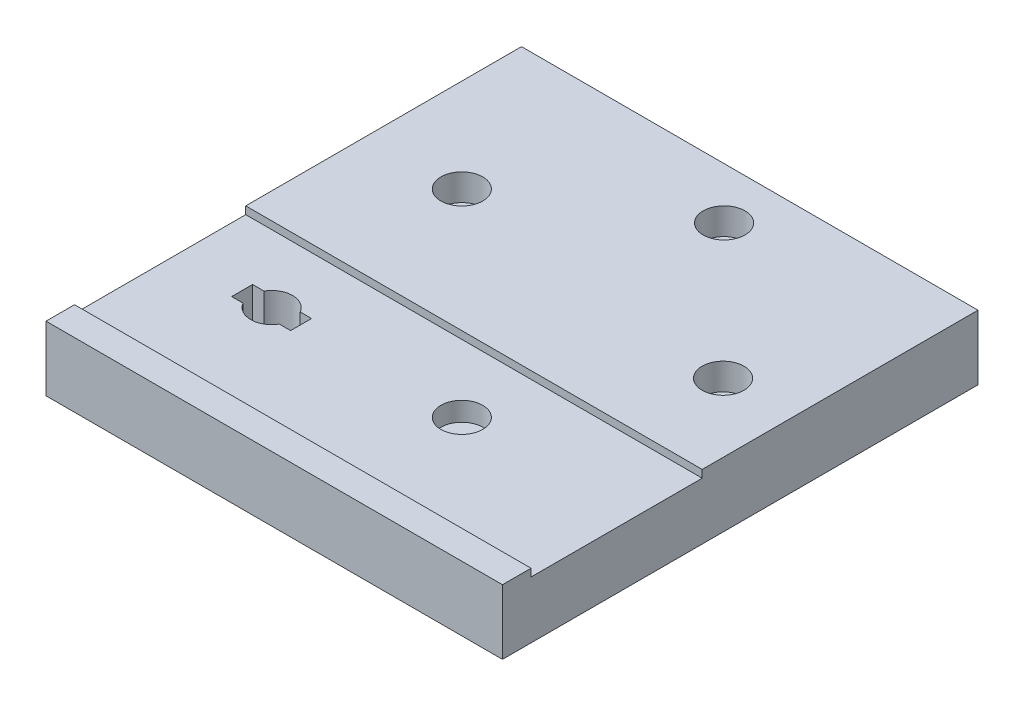
ISO-10303-21;
HEADER;
FILE_DESCRIPTION(('STEP AP214'),'2;1');
FILE_NAME('part.step','',(''),(''),'','','');
FILE_SCHEMA(('AUTOMOTIVE_DESIGN { 1 0 10303 214 1 1 1 1 }'));
ENDSEC;
DATA;
#1=APPLICATION_CONTEXT('core data for automotive mechanical design processes');
#2=APPLICATION_PROTOCOL_DEFINITION('international standard','automotive_design',2000,#1);
#3=PRODUCT_CONTEXT('',#1,'mechanical');
#4=PRODUCT('Part','Part','',(#3));
#5=PRODUCT_RELATED_PRODUCT_CATEGORY('part','',(#4));
#6=PRODUCT_DEFINITION_FORMATION('','',#4);
#7=PRODUCT_DEFINITION_CONTEXT('part definition',#1,'design');
#8=PRODUCT_DEFINITION('design','',#6,#7);
#9=PRODUCT_DEFINITION_SHAPE('','',#8);
#10=(LENGTH_UNIT() NAMED_UNIT(*) SI_UNIT(.MILLI.,.METRE.));
#11=(NAMED_UNIT(*) PLANE_ANGLE_UNIT() SI_UNIT($,.RADIAN.));
#12=(NAMED_UNIT(*) SI_UNIT($,.STERADIAN.) SOLID_ANGLE_UNIT());
#13=UNCERTAINTY_MEASURE_WITH_UNIT(LENGTH_MEASURE(1.E-05),#10,'distance_accuracy_value','');
#14=(GEOMETRIC_REPRESENTATION_CONTEXT(3) GLOBAL_UNCERTAINTY_ASSIGNED_CONTEXT((#13)) GLOBAL_UNIT_ASSIGNED_CONTEXT((#10,
#11,#12)) REPRESENTATION_CONTEXT('',''));
#15=CARTESIAN_POINT('',(0.,0.,0.));
#16=DIRECTION('',(0.,0.,1.));
#17=DIRECTION('',(1.,0.,0.));
#18=AXIS2_PLACEMENT_3D('',#15,#16,#17);
#19=CARTESIAN_POINT('',(-225.445279058098,153.,-7.25516146171794));
#20=DIRECTION('',(0.,-1.,0.));
#21=DIRECTION('',(0.,0.,-1.));
#22=AXIS2_PLACEMENT_3D('',#19,#20,#21);
#23=CYLINDRICAL_SURFACE('',#22,5.50000000000002);
#24=CARTESIAN_POINT('',(-225.445279058098,-9.99999999999999,-7.25516146171794));
#25=DIRECTION('',(0.,1.,0.));
#26=DIRECTION('',(0.,0.,1.));
#27=AXIS2_PLACEMENT_3D('',#24,#25,#26);
#28=CIRCLE('',#27,5.50000000000002);
#29=CARTESIAN_POINT('',(-230.208418778913,-9.99999999999999,-4.50516146171794));
#30=VERTEX_POINT('',#29);
#31=CARTESIAN_POINT('',(-220.682139337284,-9.99999999999999,-4.50516146171794));
#32=VERTEX_POINT('',#31);
#33=EDGE_CURVE('E212',#30,#32,#28,.T.);
#34=ORIENTED_EDGE('',*,*,#33,.F.);
#35=DIRECTION('',(0.,-1.,0.));
#36=VECTOR('',#35,1.);
#37=CARTESIAN_POINT('',(-230.208418778913,153.,-4.50516146171794));
#38=LINE('',#37,#36);
#39=CARTESIAN_POINT('',(-230.208418778913,5.,-4.50516146171794));
#40=VERTEX_POINT('',#39);
#41=EDGE_CURVE('E208',#30,#40,#38,.F.);
#42=ORIENTED_EDGE('',*,*,#41,.T.);
#43=CARTESIAN_POINT('',(-225.445279058098,5.,-7.25516146171794));
#44=DIRECTION('',(0.,-1.,0.));
#45=DIRECTION('',(0.,0.,-1.));
#46=AXIS2_PLACEMENT_3D('',#43,#44,#45);
#47=CIRCLE('',#46,5.50000000000002);
#48=CARTESIAN_POINT('',(-220.682139337284,5.,-4.50516146171794));
#49=VERTEX_POINT('',#48);
#50=EDGE_CURVE('E295',#49,#40,#47,.T.);
#51=ORIENTED_EDGE('',*,*,#50,.F.);
#52=DIRECTION('',(0.,-1.,0.));
#53=VECTOR('',#52,1.);
#54=CARTESIAN_POINT('',(-220.682139337284,153.,-4.50516146171794));
#55=LINE('',#54,#53);
#56=EDGE_CURVE('E204',#49,#32,#55,.T.);
#57=ORIENTED_EDGE('',*,*,#56,.T.);
#58=EDGE_LOOP('',(#34,#42,#51,#57));
#59=FACE_BOUND('',#58,.T.);
#60=ADVANCED_FACE('F38',(#59),#23,.F.);
#61=CARTESIAN_POINT('',(-60.,5.,27.5));
#62=DIRECTION('',(0.,0.,-1.));
#63=DIRECTION('',(-1.,0.,0.));
#64=AXIS2_PLACEMENT_3D('',#61,#62,#63);
#65=PLANE('',#64);
#66=DIRECTION('',(1.,0.,0.));
#67=VECTOR('',#66,1.);
#68=CARTESIAN_POINT('',(-250.,7.00000000000002,27.5));
#69=LINE('',#68,#67);
#70=CARTESIAN_POINT('',(-250.,7.00000000000002,27.5));
#71=VERTEX_POINT('',#70);
#72=CARTESIAN_POINT('',(-130.,7.00000000000002,27.5));
#73=VERTEX_POINT('',#72);
#74=EDGE_CURVE('E216',#71,#73,#69,.T.);
#75=ORIENTED_EDGE('',*,*,#74,.F.);
#76=DIRECTION('',(0.,1.,0.));
#77=VECTOR('',#76,1.);
#78=CARTESIAN_POINT('',(-250.,25.,27.5));
#79=LINE('',#78,#77);
#80=CARTESIAN_POINT('',(-250.,-9.99999999999999,27.5));
#81=VERTEX_POINT('',#80);
#82=EDGE_CURVE('E304',#81,#71,#79,.T.);
#83=ORIENTED_EDGE('',*,*,#82,.F.);
#84=DIRECTION('',(-1.,0.,0.));
#85=VECTOR('',#84,1.);
#86=CARTESIAN_POINT('',(-130.,-9.99999999999999,27.5));
#87=LINE('',#86,#85);
#88=CARTESIAN_POINT('',(-130.,-9.99999999999999,27.5));
#89=VERTEX_POINT('',#88);
#90=EDGE_CURVE('E248',#89,#81,#87,.T.);
#91=ORIENTED_EDGE('',*,*,#90,.F.);
#92=DIRECTION('',(0.,-1.,0.));
#93=VECTOR('',#92,1.);
#94=CARTESIAN_POINT('',(-130.,25.,27.5));
#95=LINE('',#94,#93);
#96=EDGE_CURVE('E261',#73,#89,#95,.T.);
#97=ORIENTED_EDGE('',*,*,#96,.F.);
#98=EDGE_LOOP('',(#75,#83,#91,#97));
#99=FACE_BOUND('',#98,.T.);
#100=ADVANCED_FACE('F40',(#99),#65,.F.);
#101=CARTESIAN_POINT('',(-60.,25.,20.));
#102=DIRECTION('',(0.,0.,1.));
#103=DIRECTION('',(1.,0.,0.));
#104=AXIS2_PLACEMENT_3D('',#101,#102,#103);
#105=PLANE('',#104);
#106=DIRECTION('',(-1.,0.,0.));
#107=VECTOR('',#106,1.);
#108=CARTESIAN_POINT('',(-60.,7.00000000000002,20.));
#109=LINE('',#108,#107);
#110=CARTESIAN_POINT('',(-130.,7.00000000000002,20.));
#111=VERTEX_POINT('',#110);
#112=CARTESIAN_POINT('',(-250.,7.00000000000002,20.));
#113=VERTEX_POINT('',#112);
#114=EDGE_CURVE('E241',#111,#113,#109,.T.);
#115=ORIENTED_EDGE('',*,*,#114,.F.);
#116=DIRECTION('',(0.,1.,0.));
#117=VECTOR('',#116,1.);
#118=CARTESIAN_POINT('',(-130.,25.,20.));
#119=LINE('',#118,#117);
#120=CARTESIAN_POINT('',(-130.,5.,20.));
#121=VERTEX_POINT('',#120);
#122=EDGE_CURVE('E275',#121,#111,#119,.T.);
#123=ORIENTED_EDGE('',*,*,#122,.F.);
#124=DIRECTION('',(-1.,0.,0.));
#125=VECTOR('',#124,1.);
#126=CARTESIAN_POINT('',(-60.,5.,20.));
#127=LINE('',#126,#125);
#128=CARTESIAN_POINT('',(-250.,5.,20.));
#129=VERTEX_POINT('',#128);
#130=EDGE_CURVE('E323',#121,#129,#127,.T.);
#131=ORIENTED_EDGE('',*,*,#130,.T.);
#132=DIRECTION('',(0.,-1.,0.));
#133=VECTOR('',#132,1.);
#134=CARTESIAN_POINT('',(-250.,5.,20.));
#135=LINE('',#134,#133);
#136=EDGE_CURVE('E308',#113,#129,#135,.T.);
#137=ORIENTED_EDGE('',*,*,#136,.F.);
#138=EDGE_LOOP('',(#115,#123,#131,#137));
#139=FACE_BOUND('',#138,.T.);
#140=ADVANCED_FACE('F389',(#139),#105,.F.);
#141=CARTESIAN_POINT('',(60.,25.,-25.));
#142=DIRECTION('',(0.,0.,-1.));
#143=DIRECTION('',(-1.,0.,0.));
#144=AXIS2_PLACEMENT_3D('',#141,#142,#143);
#145=PLANE('',#144);
#146=DIRECTION('',(1.,0.,0.));
#147=VECTOR('',#146,1.);
#148=CARTESIAN_POINT('',(60.,7.00000000000002,-25.));
#149=LINE('',#148,#147);
#150=CARTESIAN_POINT('',(-250.,7.00000000000002,-25.));
#151=VERTEX_POINT('',#150);
#152=CARTESIAN_POINT('',(-130.,7.00000000000002,-25.));
#153=VERTEX_POINT('',#152);
#154=EDGE_CURVE('E238',#151,#153,#149,.T.);
#155=ORIENTED_EDGE('',*,*,#154,.F.);
#156=DIRECTION('',(0.,1.,0.));
#157=VECTOR('',#156,1.);
#158=CARTESIAN_POINT('',(-250.,25.,-25.));
#159=LINE('',#158,#157);
#160=CARTESIAN_POINT('',(-250.,5.,-25.));
#161=VERTEX_POINT('',#160);
#162=EDGE_CURVE('E315',#161,#151,#159,.T.);
#163=ORIENTED_EDGE('',*,*,#162,.F.);
#164=DIRECTION('',(1.,0.,0.));
#165=VECTOR('',#164,1.);
#166=CARTESIAN_POINT('',(60.,5.,-25.));
#167=LINE('',#166,#165);
#168=CARTESIAN_POINT('',(-130.,5.,-25.));
#169=VERTEX_POINT('',#168);
#170=EDGE_CURVE('E319',#161,#169,#167,.T.);
#171=ORIENTED_EDGE('',*,*,#170,.T.);
#172=DIRECTION('',(0.,-1.,0.));
#173=VECTOR('',#172,1.);
#174=CARTESIAN_POINT('',(-130.,25.,-25.));
#175=LINE('',#174,#173);
#176=EDGE_CURVE('E269',#153,#169,#175,.T.);
#177=ORIENTED_EDGE('',*,*,#176,.F.);
#178=EDGE_LOOP('',(#155,#163,#171,#177));
#179=FACE_BOUND('',#178,.T.);
#180=ADVANCED_FACE('F410',(#179),#145,.F.);
#181=CARTESIAN_POINT('',(0.,0.,-97.5));
#182=DIRECTION('',(0.,0.,1.));
#183=DIRECTION('',(1.,0.,0.));
#184=AXIS2_PLACEMENT_3D('',#181,#182,#183);
#185=PLANE('',#184);
#186=DIRECTION('',(-1.,0.,0.));
#187=VECTOR('',#186,1.);
#188=CARTESIAN_POINT('',(-250.,7.00000000000002,-97.5));
#189=LINE('',#188,#187);
#190=CARTESIAN_POINT('',(-130.,7.00000000000002,-97.5));
#191=VERTEX_POINT('',#190);
#192=CARTESIAN_POINT('',(-250.,7.00000000000002,-97.5));
#193=VERTEX_POINT('',#192);
#194=EDGE_CURVE('E223',#191,#193,#189,.T.);
#195=ORIENTED_EDGE('',*,*,#194,.F.);
#196=DIRECTION('',(0.,1.,0.));
#197=VECTOR('',#196,1.);
#198=CARTESIAN_POINT('',(-130.,25.,-97.5));
#199=LINE('',#198,#197);
#200=CARTESIAN_POINT('',(-130.,-9.99999999999999,-97.5));
#201=VERTEX_POINT('',#200);
#202=EDGE_CURVE('E264',#201,#191,#199,.T.);
#203=ORIENTED_EDGE('',*,*,#202,.F.);
#204=DIRECTION('',(1.,0.,0.));
#205=VECTOR('',#204,1.);
#206=CARTESIAN_POINT('',(-130.,-9.99999999999999,-97.5));
#207=LINE('',#206,#205);
#208=CARTESIAN_POINT('',(-250.,-9.99999999999999,-97.5));
#209=VERTEX_POINT('',#208);
#210=EDGE_CURVE('E256',#209,#201,#207,.T.);
#211=ORIENTED_EDGE('',*,*,#210,.F.);
#212=DIRECTION('',(0.,1.,0.));
#213=VECTOR('',#212,1.);
#214=CARTESIAN_POINT('',(-250.,25.,-97.5));
#215=LINE('',#214,#213);
#216=EDGE_CURVE('E300',#209,#193,#215,.T.);
#217=ORIENTED_EDGE('',*,*,#216,.T.);
#218=EDGE_LOOP('',(#195,#203,#211,#217));
#219=FACE_BOUND('',#218,.T.);
#220=ADVANCED_FACE('F414',(#219),#185,.F.);
#221=CARTESIAN_POINT('',(-250.,0.,0.));
#222=DIRECTION('',(1.,0.,0.));
#223=DIRECTION('',(0.,0.,-1.));
#224=AXIS2_PLACEMENT_3D('',#221,#222,#223);
#225=PLANE('',#224);
#226=DIRECTION('',(0.,0.,1.));
#227=VECTOR('',#226,1.);
#228=CARTESIAN_POINT('',(-250.,7.00000000000002,-97.5));
#229=LINE('',#228,#227);
#230=EDGE_CURVE('E213',#193,#151,#229,.T.);
#231=ORIENTED_EDGE('',*,*,#230,.F.);
#232=ORIENTED_EDGE('',*,*,#216,.F.);
#233=DIRECTION('',(0.,0.,-1.));
#234=VECTOR('',#233,1.);
#235=CARTESIAN_POINT('',(-250.,-9.99999999999999,27.5));
#236=LINE('',#235,#234);
#237=EDGE_CURVE('E252',#81,#209,#236,.T.);
#238=ORIENTED_EDGE('',*,*,#237,.F.);
#239=ORIENTED_EDGE('',*,*,#82,.T.);
#240=EDGE_CURVE('E217',#113,#71,#229,.T.);
#241=ORIENTED_EDGE('',*,*,#240,.F.);
#242=ORIENTED_EDGE('',*,*,#136,.T.);
#243=DIRECTION('',(0.,0.,-1.));
#244=VECTOR('',#243,1.);
#245=CARTESIAN_POINT('',(-250.,5.,-25.));
#246=LINE('',#245,#244);
#247=EDGE_CURVE('E311',#129,#161,#246,.T.);
#248=ORIENTED_EDGE('',*,*,#247,.T.);
#249=ORIENTED_EDGE('',*,*,#162,.T.);
#250=EDGE_LOOP('',(#231,#232,#238,#239,#241,#242,#248,#249));
#251=FACE_BOUND('',#250,.T.);
#252=ADVANCED_FACE('F404',(#251),#225,.F.);
#253=CARTESIAN_POINT('',(-130.,0.,0.));
#254=DIRECTION('',(1.,0.,0.));
#255=DIRECTION('',(0.,0.,-1.));
#256=AXIS2_PLACEMENT_3D('',#253,#254,#255);
#257=PLANE('',#256);
#258=ORIENTED_EDGE('',*,*,#202,.T.);
#259=DIRECTION('',(0.,0.,1.));
#260=VECTOR('',#259,1.);
#261=CARTESIAN_POINT('',(-130.,7.00000000000002,0.));
#262=LINE('',#261,#260);
#263=EDGE_CURVE('E327',#191,#153,#262,.T.);
#264=ORIENTED_EDGE('',*,*,#263,.T.);
#265=ORIENTED_EDGE('',*,*,#176,.T.);
#266=DIRECTION('',(0.,0.,1.));
#267=VECTOR('',#266,1.);
#268=CARTESIAN_POINT('',(-130.,5.,0.));
#269=LINE('',#268,#267);
#270=EDGE_CURVE('E272',#169,#121,#269,.T.);
#271=ORIENTED_EDGE('',*,*,#270,.T.);
#272=ORIENTED_EDGE('',*,*,#122,.T.);
#273=DIRECTION('',(0.,0.,-1.));
#274=VECTOR('',#273,1.);
#275=CARTESIAN_POINT('',(-130.,7.00000000000002,-97.5));
#276=LINE('',#275,#274);
#277=EDGE_CURVE('E220',#73,#111,#276,.T.);
#278=ORIENTED_EDGE('',*,*,#277,.F.);
#279=ORIENTED_EDGE('',*,*,#96,.T.);
#280=DIRECTION('',(0.,0.,1.));
#281=VECTOR('',#280,1.);
#282=CARTESIAN_POINT('',(-130.,-9.99999999999999,27.5));
#283=LINE('',#282,#281);
#284=EDGE_CURVE('E244',#201,#89,#283,.T.);
#285=ORIENTED_EDGE('',*,*,#284,.F.);
#286=EDGE_LOOP('',(#258,#264,#265,#271,#272,#278,#279,#285));
#287=FACE_BOUND('',#286,.T.);
#288=ADVANCED_FACE('F400',(#287),#257,.T.);
#289=CARTESIAN_POINT('',(0.,5.,0.));
#290=DIRECTION('',(0.,-1.,0.));
#291=DIRECTION('',(0.,0.,-1.));
#292=AXIS2_PLACEMENT_3D('',#289,#290,#291);
#293=PLANE('',#292);
#294=ORIENTED_EDGE('',*,*,#50,.T.);
#295=DIRECTION('',(1.,0.,0.));
#296=VECTOR('',#295,1.);
#297=CARTESIAN_POINT('',(-233.195279058098,5.,-4.50516146171794));
#298=LINE('',#297,#296);
#299=CARTESIAN_POINT('',(-233.195279058098,5.,-4.50516146171794));
#300=VERTEX_POINT('',#299);
#301=EDGE_CURVE('E160',#300,#40,#298,.T.);
#302=ORIENTED_EDGE('',*,*,#301,.F.);
#303=DIRECTION('',(0.,0.,1.));
#304=VECTOR('',#303,1.);
#305=CARTESIAN_POINT('',(-233.195279058098,5.,-10.0051614617179));
#306=LINE('',#305,#304);
#307=CARTESIAN_POINT('',(-233.195279058098,5.,-10.0051614617179));
#308=VERTEX_POINT('',#307);
#309=EDGE_CURVE('E181',#308,#300,#306,.T.);
#310=ORIENTED_EDGE('',*,*,#309,.F.);
#311=DIRECTION('',(-1.,0.,0.));
#312=VECTOR('',#311,1.);
#313=CARTESIAN_POINT('',(-233.195279058098,5.,-10.0051614617179));
#314=LINE('',#313,#312);
#315=CARTESIAN_POINT('',(-230.208418778913,5.,-10.0051614617179));
#316=VERTEX_POINT('',#315);
#317=EDGE_CURVE('E171',#316,#308,#314,.T.);
#318=ORIENTED_EDGE('',*,*,#317,.F.);
#319=CARTESIAN_POINT('',(-220.682139337284,5.,-10.0051614617179));
#320=VERTEX_POINT('',#319);
#321=EDGE_CURVE('E179',#316,#320,#47,.T.);
#322=ORIENTED_EDGE('',*,*,#321,.T.);
#323=CARTESIAN_POINT('',(-217.695279058098,5.,-10.0051614617179));
#324=VERTEX_POINT('',#323);
#325=EDGE_CURVE('E155',#324,#320,#314,.T.);
#326=ORIENTED_EDGE('',*,*,#325,.F.);
#327=DIRECTION('',(0.,0.,-1.));
#328=VECTOR('',#327,1.);
#329=CARTESIAN_POINT('',(-217.695279058098,5.,-10.0051614617179));
#330=LINE('',#329,#328);
#331=CARTESIAN_POINT('',(-217.695279058098,5.,-4.50516146171794));
#332=VERTEX_POINT('',#331);
#333=EDGE_CURVE('E163',#332,#324,#330,.T.);
#334=ORIENTED_EDGE('',*,*,#333,.F.);
#335=EDGE_CURVE('E186',#49,#332,#298,.T.);
#336=ORIENTED_EDGE('',*,*,#335,.F.);
#337=EDGE_LOOP('',(#294,#302,#310,#318,#322,#326,#334,#336));
#338=FACE_BOUND('',#337,.T.);
#339=CARTESIAN_POINT('',(-175.445279058098,5.,-7.25516146171793));
#340=DIRECTION('',(0.,-1.,0.));
#341=DIRECTION('',(0.,0.,-1.));
#342=AXIS2_PLACEMENT_3D('',#339,#340,#341);
#343=CIRCLE('',#342,5.50000000000002);
#344=CARTESIAN_POINT('',(-175.445279058098,5.,-12.755161461718));
#345=VERTEX_POINT('',#344);
#346=EDGE_CURVE('E296',#345,#345,#343,.T.);
#347=ORIENTED_EDGE('',*,*,#346,.T.);
#348=EDGE_LOOP('',(#347));
#349=FACE_BOUND('',#348,.T.);
#350=ORIENTED_EDGE('',*,*,#270,.F.);
#351=ORIENTED_EDGE('',*,*,#170,.F.);
#352=ORIENTED_EDGE('',*,*,#247,.F.);
#353=ORIENTED_EDGE('',*,*,#130,.F.);
#354=EDGE_LOOP('',(#350,#351,#352,#353));
#355=FACE_BOUND('',#354,.T.);
#356=ADVANCED_FACE('F175',(#338,#349,#355),#293,.F.);
#357=CARTESIAN_POINT('',(-220.682139337284,-9.99999999999999,-10.0051614617179));
#358=VERTEX_POINT('',#357);
#359=CARTESIAN_POINT('',(-230.208418778913,-9.99999999999999,-10.0051614617179));
#360=VERTEX_POINT('',#359);
#361=EDGE_CURVE('E335',#358,#360,#28,.T.);
#362=ORIENTED_EDGE('',*,*,#361,.F.);
#363=DIRECTION('',(0.,-1.,0.));
#364=VECTOR('',#363,1.);
#365=CARTESIAN_POINT('',(-220.682139337284,153.,-10.0051614617179));
#366=LINE('',#365,#364);
#367=EDGE_CURVE('E63',#358,#320,#366,.F.);
#368=ORIENTED_EDGE('',*,*,#367,.T.);
#369=ORIENTED_EDGE('',*,*,#321,.F.);
#370=DIRECTION('',(0.,-1.,0.));
#371=VECTOR('',#370,1.);
#372=CARTESIAN_POINT('',(-230.208418778913,153.,-10.0051614617179));
#373=LINE('',#372,#371);
#374=EDGE_CURVE('E193',#316,#360,#373,.T.);
#375=ORIENTED_EDGE('',*,*,#374,.T.);
#376=EDGE_LOOP('',(#362,#368,#369,#375));
#377=FACE_BOUND('',#376,.T.);
#378=ADVANCED_FACE('F368',(#377),#23,.F.);
#379=CARTESIAN_POINT('',(-175.445279058098,153.,-7.25516146171793));
#380=DIRECTION('',(0.,-1.,0.));
#381=DIRECTION('',(0.,0.,-1.));
#382=AXIS2_PLACEMENT_3D('',#379,#380,#381);
#383=CYLINDRICAL_SURFACE('',#382,5.50000000000002);
#384=CARTESIAN_POINT('',(-175.445279058098,0.,-7.25516146171793));
#385=DIRECTION('',(0.,-1.,0.));
#386=DIRECTION('',(0.,0.,-1.));
#387=AXIS2_PLACEMENT_3D('',#384,#385,#386);
#388=CIRCLE('',#387,5.50000000000002);
#389=CARTESIAN_POINT('',(-175.445279058098,0.,-12.755161461718));
#390=VERTEX_POINT('',#389);
#391=EDGE_CURVE('E283',#390,#390,#388,.T.);
#392=ORIENTED_EDGE('',*,*,#391,.T.);
#393=EDGE_LOOP('',(#392));
#394=FACE_BOUND('',#393,.T.);
#395=ORIENTED_EDGE('',*,*,#346,.F.);
#396=EDGE_LOOP('',(#395));
#397=FACE_BOUND('',#396,.T.);
#398=ADVANCED_FACE('F393',(#394,#397),#383,.F.);
#399=CARTESIAN_POINT('',(0.,0.,0.));
#400=DIRECTION('',(0.,1.,0.));
#401=DIRECTION('',(0.,0.,1.));
#402=AXIS2_PLACEMENT_3D('',#399,#400,#401);
#403=PLANE('',#402);
#404=ORIENTED_EDGE('',*,*,#391,.F.);
#405=EDGE_LOOP('',(#404));
#406=FACE_BOUND('',#405,.T.);
#407=ADVANCED_FACE('F397',(#406),#403,.T.);
#408=CARTESIAN_POINT('',(0.,-9.99999999999999,0.));
#409=DIRECTION('',(0.,1.,0.));
#410=DIRECTION('',(0.,0.,1.));
#411=AXIS2_PLACEMENT_3D('',#408,#409,#410);
#412=PLANE('',#411);
#413=ORIENTED_EDGE('',*,*,#33,.T.);
#414=DIRECTION('',(1.,0.,0.));
#415=VECTOR('',#414,1.);
#416=CARTESIAN_POINT('',(0.,-9.99999999999999,-4.50516146171794));
#417=LINE('',#416,#415);
#418=CARTESIAN_POINT('',(-217.695279058098,-9.99999999999999,-4.50516146171794));
#419=VERTEX_POINT('',#418);
#420=EDGE_CURVE('E11',#32,#419,#417,.T.);
#421=ORIENTED_EDGE('',*,*,#420,.T.);
#422=DIRECTION('',(0.,0.,-1.));
#423=VECTOR('',#422,1.);
#424=CARTESIAN_POINT('',(-217.695279058098,-9.99999999999999,0.));
#425=LINE('',#424,#423);
#426=CARTESIAN_POINT('',(-217.695279058098,-9.99999999999999,-10.0051614617179));
#427=VERTEX_POINT('',#426);
#428=EDGE_CURVE('E42',#419,#427,#425,.T.);
#429=ORIENTED_EDGE('',*,*,#428,.T.);
#430=DIRECTION('',(-1.,0.,0.));
#431=VECTOR('',#430,1.);
#432=CARTESIAN_POINT('',(0.,-9.99999999999999,-10.0051614617179));
#433=LINE('',#432,#431);
#434=EDGE_CURVE('E156',#427,#358,#433,.T.);
#435=ORIENTED_EDGE('',*,*,#434,.T.);
#436=ORIENTED_EDGE('',*,*,#361,.T.);
#437=CARTESIAN_POINT('',(-233.195279058098,-9.99999999999999,-10.0051614617179));
#438=VERTEX_POINT('',#437);
#439=EDGE_CURVE('E331',#360,#438,#433,.T.);
#440=ORIENTED_EDGE('',*,*,#439,.T.);
#441=DIRECTION('',(0.,0.,1.));
#442=VECTOR('',#441,1.);
#443=CARTESIAN_POINT('',(-233.195279058098,-9.99999999999999,0.));
#444=LINE('',#443,#442);
#445=CARTESIAN_POINT('',(-233.195279058098,-9.99999999999999,-4.50516146171794));
#446=VERTEX_POINT('',#445);
#447=EDGE_CURVE('E339',#438,#446,#444,.T.);
#448=ORIENTED_EDGE('',*,*,#447,.T.);
#449=EDGE_CURVE('E48',#446,#30,#417,.T.);
#450=ORIENTED_EDGE('',*,*,#449,.T.);
#451=EDGE_LOOP('',(#413,#421,#429,#435,#436,#440,#448,#450));
#452=FACE_BOUND('',#451,.T.);
#453=ORIENTED_EDGE('',*,*,#284,.T.);
#454=ORIENTED_EDGE('',*,*,#90,.T.);
#455=ORIENTED_EDGE('',*,*,#237,.T.);
#456=ORIENTED_EDGE('',*,*,#210,.T.);
#457=EDGE_LOOP('',(#453,#454,#455,#456));
#458=FACE_BOUND('',#457,.T.);
#459=ADVANCED_FACE('F350',(#452,#458),#412,.F.);
#460=CARTESIAN_POINT('',(0.,7.00000000000002,0.));
#461=DIRECTION('',(0.,1.,0.));
#462=DIRECTION('',(0.,0.,1.));
#463=AXIS2_PLACEMENT_3D('',#460,#461,#462);
#464=PLANE('',#463);
#465=ORIENTED_EDGE('',*,*,#114,.T.);
#466=ORIENTED_EDGE('',*,*,#240,.T.);
#467=ORIENTED_EDGE('',*,*,#74,.T.);
#468=ORIENTED_EDGE('',*,*,#277,.T.);
#469=EDGE_LOOP('',(#465,#466,#467,#468));
#470=FACE_BOUND('',#469,.T.);
#471=ADVANCED_FACE('F445',(#470),#464,.T.);
#472=CARTESIAN_POINT('',(-183.240850763284,7.00000000000003,-83.9875418560589));
#473=DIRECTION('',(0.,1.,0.));
#474=DIRECTION('',(0.,0.,1.));
#475=AXIS2_PLACEMENT_3D('',#472,#473,#474);
#476=CIRCLE('',#475,5.50000000000002);
#477=CARTESIAN_POINT('',(-183.240850763284,7.00000000000003,-78.4875418560588));
#478=VERTEX_POINT('',#477);
#479=EDGE_CURVE('E234',#478,#478,#476,.F.);
#480=ORIENTED_EDGE('',*,*,#479,.T.);
#481=EDGE_LOOP('',(#480));
#482=FACE_BOUND('',#481,.T.);
#483=CARTESIAN_POINT('',(-148.018210700188,7.00000000000003,-48.5));
#484=DIRECTION('',(0.,1.,0.));
#485=DIRECTION('',(0.,0.,1.));
#486=AXIS2_PLACEMENT_3D('',#483,#484,#485);
#487=CIRCLE('',#486,5.50000000000002);
#488=CARTESIAN_POINT('',(-148.018210700188,7.00000000000003,-43.));
#489=VERTEX_POINT('',#488);
#490=EDGE_CURVE('E230',#489,#489,#487,.F.);
#491=ORIENTED_EDGE('',*,*,#490,.T.);
#492=EDGE_LOOP('',(#491));
#493=FACE_BOUND('',#492,.T.);
#494=CARTESIAN_POINT('',(-225.445279058098,7.00000000000003,-57.2551614617179));
#495=DIRECTION('',(0.,1.,0.));
#496=DIRECTION('',(0.,0.,1.));
#497=AXIS2_PLACEMENT_3D('',#494,#495,#496);
#498=CIRCLE('',#497,5.50000000000002);
#499=CARTESIAN_POINT('',(-225.445279058098,7.00000000000003,-51.7551614617179));
#500=VERTEX_POINT('',#499);
#501=EDGE_CURVE('E226',#500,#500,#498,.F.);
#502=ORIENTED_EDGE('',*,*,#501,.T.);
#503=EDGE_LOOP('',(#502));
#504=FACE_BOUND('',#503,.T.);
#505=ORIENTED_EDGE('',*,*,#154,.T.);
#506=ORIENTED_EDGE('',*,*,#263,.F.);
#507=ORIENTED_EDGE('',*,*,#194,.T.);
#508=ORIENTED_EDGE('',*,*,#230,.T.);
#509=EDGE_LOOP('',(#505,#506,#507,#508));
#510=FACE_BOUND('',#509,.T.);
#511=ADVANCED_FACE('F435',(#482,#493,#504,#510),#464,.T.);
#512=CARTESIAN_POINT('',(-225.445279058098,0.,-57.2551614617179));
#513=DIRECTION('',(0.,-1.,0.));
#514=DIRECTION('',(0.,0.,-1.));
#515=AXIS2_PLACEMENT_3D('',#512,#513,#514);
#516=CIRCLE('',#515,5.50000000000002);
#517=CARTESIAN_POINT('',(-225.445279058098,0.,-62.755161461718));
#518=VERTEX_POINT('',#517);
#519=EDGE_CURVE('E265',#518,#518,#516,.T.);
#520=ORIENTED_EDGE('',*,*,#519,.F.);
#521=EDGE_LOOP('',(#520));
#522=FACE_BOUND('',#521,.T.);
#523=ADVANCED_FACE('F452',(#522),#403,.T.);
#524=CARTESIAN_POINT('',(-225.445279058098,153.,-57.2551614617179));
#525=DIRECTION('',(0.,-1.,0.));
#526=DIRECTION('',(0.,0.,-1.));
#527=AXIS2_PLACEMENT_3D('',#524,#525,#526);
#528=CYLINDRICAL_SURFACE('',#527,5.50000000000002);
#529=ORIENTED_EDGE('',*,*,#519,.T.);
#530=EDGE_LOOP('',(#529));
#531=FACE_BOUND('',#530,.T.);
#532=ORIENTED_EDGE('',*,*,#501,.F.);
#533=EDGE_LOOP('',(#532));
#534=FACE_BOUND('',#533,.T.);
#535=ADVANCED_FACE('F458',(#531,#534),#528,.F.);
#536=CARTESIAN_POINT('',(-148.018210700188,0.,-48.5));
#537=DIRECTION('',(0.,-1.,0.));
#538=DIRECTION('',(0.,0.,-1.));
#539=AXIS2_PLACEMENT_3D('',#536,#537,#538);
#540=CIRCLE('',#539,5.50000000000002);
#541=CARTESIAN_POINT('',(-148.018210700188,0.,-54.));
#542=VERTEX_POINT('',#541);
#543=EDGE_CURVE('E279',#542,#542,#540,.T.);
#544=ORIENTED_EDGE('',*,*,#543,.F.);
#545=EDGE_LOOP('',(#544));
#546=FACE_BOUND('',#545,.T.);
#547=ADVANCED_FACE('F463',(#546),#403,.T.);
#548=CARTESIAN_POINT('',(-148.018210700188,153.,-48.5));
#549=DIRECTION('',(0.,-1.,0.));
#550=DIRECTION('',(0.,0.,-1.));
#551=AXIS2_PLACEMENT_3D('',#548,#549,#550);
#552=CYLINDRICAL_SURFACE('',#551,5.50000000000002);
#553=ORIENTED_EDGE('',*,*,#543,.T.);
#554=EDGE_LOOP('',(#553));
#555=FACE_BOUND('',#554,.T.);
#556=ORIENTED_EDGE('',*,*,#490,.F.);
#557=EDGE_LOOP('',(#556));
#558=FACE_BOUND('',#557,.T.);
#559=ADVANCED_FACE('F461',(#555,#558),#552,.F.);
#560=CARTESIAN_POINT('',(-183.240850763284,0.,-83.9875418560589));
#561=DIRECTION('',(0.,-1.,0.));
#562=DIRECTION('',(0.,0.,-1.));
#563=AXIS2_PLACEMENT_3D('',#560,#561,#562);
#564=CIRCLE('',#563,5.50000000000002);
#565=CARTESIAN_POINT('',(-183.240850763284,0.,-89.4875418560589));
#566=VERTEX_POINT('',#565);
#567=EDGE_CURVE('E260',#566,#566,#564,.T.);
#568=ORIENTED_EDGE('',*,*,#567,.F.);
#569=EDGE_LOOP('',(#568));
#570=FACE_BOUND('',#569,.T.);
#571=ADVANCED_FACE('F379',(#570),#403,.T.);
#572=CARTESIAN_POINT('',(-183.240850763284,153.,-83.9875418560589));
#573=DIRECTION('',(0.,-1.,0.));
#574=DIRECTION('',(0.,0.,-1.));
#575=AXIS2_PLACEMENT_3D('',#572,#573,#574);
#576=CYLINDRICAL_SURFACE('',#575,5.50000000000002);
#577=ORIENTED_EDGE('',*,*,#567,.T.);
#578=EDGE_LOOP('',(#577));
#579=FACE_BOUND('',#578,.T.);
#580=ORIENTED_EDGE('',*,*,#479,.F.);
#581=EDGE_LOOP('',(#580));
#582=FACE_BOUND('',#581,.T.);
#583=ADVANCED_FACE('F371',(#579,#582),#576,.F.);
#584=CARTESIAN_POINT('',(-233.195279058098,-26.,-10.0051614617179));
#585=DIRECTION('',(0.,0.,-1.));
#586=DIRECTION('',(-1.,0.,0.));
#587=AXIS2_PLACEMENT_3D('',#584,#585,#586);
#588=PLANE('',#587);
#589=ORIENTED_EDGE('',*,*,#317,.T.);
#590=DIRECTION('',(0.,1.,0.));
#591=VECTOR('',#590,1.);
#592=CARTESIAN_POINT('',(-233.195279058098,-26.,-10.0051614617179));
#593=LINE('',#592,#591);
#594=EDGE_CURVE('E55',#438,#308,#593,.T.);
#595=ORIENTED_EDGE('',*,*,#594,.F.);
#596=ORIENTED_EDGE('',*,*,#439,.F.);
#597=ORIENTED_EDGE('',*,*,#374,.F.);
#598=EDGE_LOOP('',(#589,#595,#596,#597));
#599=FACE_BOUND('',#598,.T.);
#600=ADVANCED_FACE('F369',(#599),#588,.F.);
#601=CARTESIAN_POINT('',(-233.195279058098,-26.,-10.0051614617179));
#602=DIRECTION('',(-1.,0.,0.));
#603=DIRECTION('',(0.,0.,1.));
#604=AXIS2_PLACEMENT_3D('',#601,#602,#603);
#605=PLANE('',#604);
#606=ORIENTED_EDGE('',*,*,#594,.T.);
#607=ORIENTED_EDGE('',*,*,#309,.T.);
#608=DIRECTION('',(0.,1.,0.));
#609=VECTOR('',#608,1.);
#610=CARTESIAN_POINT('',(-233.195279058098,-26.,-4.50516146171794));
#611=LINE('',#610,#609);
#612=EDGE_CURVE('E194',#446,#300,#611,.T.);
#613=ORIENTED_EDGE('',*,*,#612,.F.);
#614=ORIENTED_EDGE('',*,*,#447,.F.);
#615=EDGE_LOOP('',(#606,#607,#613,#614));
#616=FACE_BOUND('',#615,.T.);
#617=ADVANCED_FACE('F366',(#616),#605,.F.);
#618=CARTESIAN_POINT('',(-233.195279058098,-26.,-4.50516146171794));
#619=DIRECTION('',(0.,0.,1.));
#620=DIRECTION('',(1.,0.,0.));
#621=AXIS2_PLACEMENT_3D('',#618,#619,#620);
#622=PLANE('',#621);
#623=ORIENTED_EDGE('',*,*,#449,.F.);
#624=ORIENTED_EDGE('',*,*,#612,.T.);
#625=ORIENTED_EDGE('',*,*,#301,.T.);
#626=ORIENTED_EDGE('',*,*,#41,.F.);
#627=EDGE_LOOP('',(#623,#624,#625,#626));
#628=FACE_BOUND('',#627,.T.);
#629=ADVANCED_FACE('F363',(#628),#622,.F.);
#630=CARTESIAN_POINT('',(-217.695279058098,-26.,-10.0051614617179));
#631=DIRECTION('',(1.,0.,0.));
#632=DIRECTION('',(0.,0.,-1.));
#633=AXIS2_PLACEMENT_3D('',#630,#631,#632);
#634=PLANE('',#633);
#635=DIRECTION('',(0.,1.,0.));
#636=VECTOR('',#635,1.);
#637=CARTESIAN_POINT('',(-217.695279058098,-26.,-4.50516146171794));
#638=LINE('',#637,#636);
#639=EDGE_CURVE('E166',#419,#332,#638,.T.);
#640=ORIENTED_EDGE('',*,*,#639,.T.);
#641=ORIENTED_EDGE('',*,*,#333,.T.);
#642=DIRECTION('',(0.,1.,0.));
#643=VECTOR('',#642,1.);
#644=CARTESIAN_POINT('',(-217.695279058098,-26.,-10.0051614617179));
#645=LINE('',#644,#643);
#646=EDGE_CURVE('E151',#427,#324,#645,.T.);
#647=ORIENTED_EDGE('',*,*,#646,.F.);
#648=ORIENTED_EDGE('',*,*,#428,.F.);
#649=EDGE_LOOP('',(#640,#641,#647,#648));
#650=FACE_BOUND('',#649,.T.);
#651=ADVANCED_FACE('F164',(#650),#634,.F.);
#652=ORIENTED_EDGE('',*,*,#335,.T.);
#653=ORIENTED_EDGE('',*,*,#639,.F.);
#654=ORIENTED_EDGE('',*,*,#420,.F.);
#655=ORIENTED_EDGE('',*,*,#56,.F.);
#656=EDGE_LOOP('',(#652,#653,#654,#655));
#657=FACE_BOUND('',#656,.T.);
#658=ADVANCED_FACE('F353',(#657),#622,.F.);
#659=ORIENTED_EDGE('',*,*,#434,.F.);
#660=ORIENTED_EDGE('',*,*,#646,.T.);
#661=ORIENTED_EDGE('',*,*,#325,.T.);
#662=ORIENTED_EDGE('',*,*,#367,.F.);
#663=EDGE_LOOP('',(#659,#660,#661,#662));
#664=FACE_BOUND('',#663,.T.);
#665=ADVANCED_FACE('F153',(#664),#588,.F.);
#666=CLOSED_SHELL('',(#60,#100,#140,#180,#220,#252,#288,#356,#378,#398,#407,#459,#471,#511,#523,
#535,#547,#559,#571,#583,#600,#617,#629,#651,#658,#665));
#667=MANIFOLD_SOLID_BREP('B2',#666);
#668=ADVANCED_BREP_SHAPE_REPRESENTATION('',(#18,#667),#14);
#669=SHAPE_DEFINITION_REPRESENTATION(#9,#668);
ENDSEC;
END-ISO-10303-21;
